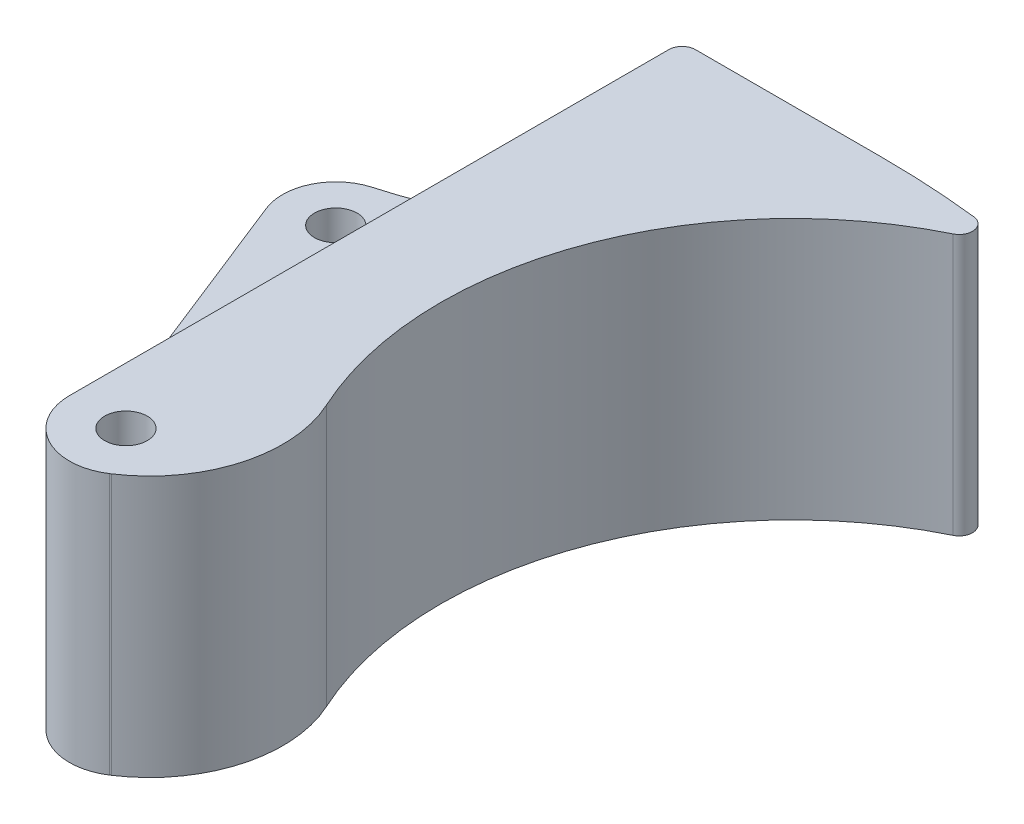
ISO-10303-21;
HEADER;
FILE_DESCRIPTION(('STEP AP214'),'2;1');
FILE_NAME('part.step','',(''),(''),'','','');
FILE_SCHEMA(('AUTOMOTIVE_DESIGN { 1 0 10303 214 1 1 1 1 }'));
ENDSEC;
DATA;
#1=APPLICATION_CONTEXT('core data for automotive mechanical design processes');
#2=APPLICATION_PROTOCOL_DEFINITION('international standard','automotive_design',2000,#1);
#3=PRODUCT_CONTEXT('',#1,'mechanical');
#4=PRODUCT('Part','Part','',(#3));
#5=PRODUCT_RELATED_PRODUCT_CATEGORY('part','',(#4));
#6=PRODUCT_DEFINITION_FORMATION('','',#4);
#7=PRODUCT_DEFINITION_CONTEXT('part definition',#1,'design');
#8=PRODUCT_DEFINITION('design','',#6,#7);
#9=PRODUCT_DEFINITION_SHAPE('','',#8);
#10=(LENGTH_UNIT() NAMED_UNIT(*) SI_UNIT(.MILLI.,.METRE.));
#11=(NAMED_UNIT(*) PLANE_ANGLE_UNIT() SI_UNIT($,.RADIAN.));
#12=(NAMED_UNIT(*) SI_UNIT($,.STERADIAN.) SOLID_ANGLE_UNIT());
#13=UNCERTAINTY_MEASURE_WITH_UNIT(LENGTH_MEASURE(1.E-05),#10,'distance_accuracy_value','');
#14=(GEOMETRIC_REPRESENTATION_CONTEXT(3) GLOBAL_UNCERTAINTY_ASSIGNED_CONTEXT((#13)) GLOBAL_UNIT_ASSIGNED_CONTEXT((#10,
#11,#12)) REPRESENTATION_CONTEXT('',''));
#15=CARTESIAN_POINT('',(0.,0.,0.));
#16=DIRECTION('',(0.,0.,1.));
#17=DIRECTION('',(1.,0.,0.));
#18=AXIS2_PLACEMENT_3D('',#15,#16,#17);
#19=CARTESIAN_POINT('',(0.,12.446,0.));
#20=DIRECTION('',(0.,1.,0.));
#21=DIRECTION('',(0.,0.,1.));
#22=AXIS2_PLACEMENT_3D('',#19,#20,#21);
#23=PLANE('',#22);
#24=DIRECTION('',(-1.,0.,0.));
#25=VECTOR('',#24,1.);
#26=CARTESIAN_POINT('',(-5.39750000000001,12.446,-58.42));
#27=LINE('',#26,#25);
#28=CARTESIAN_POINT('',(13.6525,12.446,-58.42));
#29=VERTEX_POINT('',#28);
#30=CARTESIAN_POINT('',(-4.12750000000001,12.446,-58.42));
#31=VERTEX_POINT('',#30);
#32=EDGE_CURVE('E224',#29,#31,#27,.T.);
#33=ORIENTED_EDGE('',*,*,#32,.T.);
#34=CARTESIAN_POINT('',(-4.12750000000001,12.446,-57.15));
#35=DIRECTION('',(0.,1.,0.));
#36=DIRECTION('',(0.,0.,1.));
#37=AXIS2_PLACEMENT_3D('',#34,#35,#36);
#38=CIRCLE('',#37,1.27);
#39=CARTESIAN_POINT('',(-5.39750000000001,12.446,-57.15));
#40=VERTEX_POINT('',#39);
#41=EDGE_CURVE('E300',#31,#40,#38,.T.);
#42=ORIENTED_EDGE('',*,*,#41,.T.);
#43=DIRECTION('',(0.,0.,1.));
#44=VECTOR('',#43,1.);
#45=CARTESIAN_POINT('',(-5.39750000000001,12.446,-58.42));
#46=LINE('',#45,#44);
#47=CARTESIAN_POINT('',(-5.3975,12.446,0.));
#48=VERTEX_POINT('',#47);
#49=EDGE_CURVE('E207',#40,#48,#46,.T.);
#50=ORIENTED_EDGE('',*,*,#49,.T.);
#51=CARTESIAN_POINT('',(0.,12.446,0.));
#52=DIRECTION('',(0.,1.,0.));
#53=DIRECTION('',(0.,0.,1.));
#54=AXIS2_PLACEMENT_3D('',#51,#52,#53);
#55=CIRCLE('',#54,5.3975);
#56=CARTESIAN_POINT('',(2.96093479689993,12.446,4.51285623286485));
#57=VERTEX_POINT('',#56);
#58=EDGE_CURVE('E210',#48,#57,#55,.T.);
#59=ORIENTED_EDGE('',*,*,#58,.T.);
#60=DIRECTION('',(0.836101201086587,0.,-0.548575228698459));
#61=VECTOR('',#60,1.);
#62=CARTESIAN_POINT('',(2.96093479689993,12.446,4.51285623286485));
#63=LINE('',#62,#61);
#64=CARTESIAN_POINT('',(3.06233772324981,12.446,4.44632465338525));
#65=VERTEX_POINT('',#64);
#66=EDGE_CURVE('E214',#57,#65,#63,.T.);
#67=ORIENTED_EDGE('',*,*,#66,.T.);
#68=CARTESIAN_POINT('',(-3.90456768122061,12.446,-6.1721606004144));
#69=DIRECTION('',(0.,1.,0.));
#70=DIRECTION('',(0.,0.,1.));
#71=AXIS2_PLACEMENT_3D('',#68,#69,#70);
#72=CIRCLE('',#71,12.7);
#73=CARTESIAN_POINT('',(7.64307979127989,12.446,-11.4581645590634));
#74=VERTEX_POINT('',#73);
#75=EDGE_CURVE('E269',#65,#74,#72,.T.);
#76=ORIENTED_EDGE('',*,*,#75,.T.);
#77=CARTESIAN_POINT('',(38.1,12.446,-25.4));
#78=DIRECTION('',(0.,-1.,0.));
#79=DIRECTION('',(0.,0.,1.));
#80=AXIS2_PLACEMENT_3D('',#77,#78,#79);
#81=CIRCLE('',#80,33.49625);
#82=CARTESIAN_POINT('',(23.3731145766902,12.446,-55.485172590351));
#83=VERTEX_POINT('',#82);
#84=EDGE_CURVE('E218',#74,#83,#81,.T.);
#85=ORIENTED_EDGE('',*,*,#84,.T.);
#86=CARTESIAN_POINT('',(22.8147492525837,12.446,-56.62584264117));
#87=DIRECTION('',(0.,1.,0.));
#88=DIRECTION('',(0.,0.,1.));
#89=AXIS2_PLACEMENT_3D('',#86,#87,#88);
#90=CIRCLE('',#89,1.27);
#91=CARTESIAN_POINT('',(22.9595844996685,12.446,-57.8875568525514));
#92=VERTEX_POINT('',#91);
#93=EDGE_CURVE('E59',#83,#92,#90,.T.);
#94=ORIENTED_EDGE('',*,*,#93,.T.);
#95=CARTESIAN_POINT('',(13.6525,12.446,23.1899502882853));
#96=DIRECTION('',(0.,1.,0.));
#97=DIRECTION('',(0.,0.,1.));
#98=AXIS2_PLACEMENT_3D('',#95,#96,#97);
#99=CIRCLE('',#98,81.6099502882853);
#100=EDGE_CURVE('E221',#92,#29,#99,.T.);
#101=ORIENTED_EDGE('',*,*,#100,.T.);
#102=EDGE_LOOP('',(#33,#42,#50,#59,#67,#76,#85,#94,#101));
#103=FACE_BOUND('',#102,.T.);
#104=CARTESIAN_POINT('',(0.,12.446,0.));
#105=DIRECTION('',(0.,1.,0.));
#106=DIRECTION('',(0.,0.,1.));
#107=AXIS2_PLACEMENT_3D('',#104,#105,#106);
#108=CIRCLE('',#107,2.032);
#109=CARTESIAN_POINT('',(0.,12.446,2.032));
#110=VERTEX_POINT('',#109);
#111=EDGE_CURVE('E199',#110,#110,#108,.T.);
#112=ORIENTED_EDGE('',*,*,#111,.F.);
#113=EDGE_LOOP('',(#112));
#114=FACE_BOUND('',#113,.T.);
#115=ADVANCED_FACE('F43',(#103,#114),#23,.T.);
#116=CARTESIAN_POINT('',(0.,-12.446,0.));
#117=DIRECTION('',(0.,1.,0.));
#118=DIRECTION('',(0.,0.,1.));
#119=AXIS2_PLACEMENT_3D('',#116,#117,#118);
#120=PLANE('',#119);
#121=DIRECTION('',(0.,0.,1.));
#122=VECTOR('',#121,1.);
#123=CARTESIAN_POINT('',(-5.39750000000001,-12.446,-58.42));
#124=LINE('',#123,#122);
#125=CARTESIAN_POINT('',(-5.39750000000001,-12.446,-57.15));
#126=VERTEX_POINT('',#125);
#127=CARTESIAN_POINT('',(-5.3975,-12.446,0.));
#128=VERTEX_POINT('',#127);
#129=EDGE_CURVE('E203',#126,#128,#124,.T.);
#130=ORIENTED_EDGE('',*,*,#129,.F.);
#131=CARTESIAN_POINT('',(-4.12750000000001,-12.446,-57.15));
#132=DIRECTION('',(0.,1.,0.));
#133=DIRECTION('',(0.,0.,1.));
#134=AXIS2_PLACEMENT_3D('',#131,#132,#133);
#135=CIRCLE('',#134,1.27);
#136=CARTESIAN_POINT('',(-4.12750000000001,-12.446,-58.42));
#137=VERTEX_POINT('',#136);
#138=EDGE_CURVE('E292',#126,#137,#135,.F.);
#139=ORIENTED_EDGE('',*,*,#138,.T.);
#140=DIRECTION('',(-1.,0.,0.));
#141=VECTOR('',#140,1.);
#142=CARTESIAN_POINT('',(-5.39750000000001,-12.446,-58.42));
#143=LINE('',#142,#141);
#144=CARTESIAN_POINT('',(13.6525,-12.446,-58.42));
#145=VERTEX_POINT('',#144);
#146=EDGE_CURVE('E211',#145,#137,#143,.T.);
#147=ORIENTED_EDGE('',*,*,#146,.F.);
#148=CARTESIAN_POINT('',(13.6525,-12.446,23.1899502882853));
#149=DIRECTION('',(0.,1.,0.));
#150=DIRECTION('',(0.,0.,1.));
#151=AXIS2_PLACEMENT_3D('',#148,#149,#150);
#152=CIRCLE('',#151,81.6099502882853);
#153=CARTESIAN_POINT('',(22.9595844996685,-12.446,-57.8875568525514));
#154=VERTEX_POINT('',#153);
#155=EDGE_CURVE('E241',#154,#145,#152,.T.);
#156=ORIENTED_EDGE('',*,*,#155,.F.);
#157=CARTESIAN_POINT('',(22.8147492525837,-12.446,-56.62584264117));
#158=DIRECTION('',(0.,1.,0.));
#159=DIRECTION('',(0.,0.,1.));
#160=AXIS2_PLACEMENT_3D('',#157,#158,#159);
#161=CIRCLE('',#160,1.27);
#162=CARTESIAN_POINT('',(23.3731145766902,-12.446,-55.485172590351));
#163=VERTEX_POINT('',#162);
#164=EDGE_CURVE('E289',#154,#163,#161,.F.);
#165=ORIENTED_EDGE('',*,*,#164,.T.);
#166=CARTESIAN_POINT('',(38.1,-12.446,-25.4));
#167=DIRECTION('',(0.,-1.,0.));
#168=DIRECTION('',(0.,0.,1.));
#169=AXIS2_PLACEMENT_3D('',#166,#167,#168);
#170=CIRCLE('',#169,33.49625);
#171=CARTESIAN_POINT('',(7.64307979127989,-12.446,-11.4581645590634));
#172=VERTEX_POINT('',#171);
#173=EDGE_CURVE('E238',#172,#163,#170,.T.);
#174=ORIENTED_EDGE('',*,*,#173,.F.);
#175=CARTESIAN_POINT('',(-3.90456768122061,-12.446,-6.1721606004144));
#176=DIRECTION('',(0.,1.,0.));
#177=DIRECTION('',(0.,0.,1.));
#178=AXIS2_PLACEMENT_3D('',#175,#176,#177);
#179=CIRCLE('',#178,12.7);
#180=CARTESIAN_POINT('',(3.06233772324981,-12.446,4.44632465338525));
#181=VERTEX_POINT('',#180);
#182=EDGE_CURVE('E263',#172,#181,#179,.F.);
#183=ORIENTED_EDGE('',*,*,#182,.T.);
#184=DIRECTION('',(0.836101201086587,0.,-0.548575228698459));
#185=VECTOR('',#184,1.);
#186=CARTESIAN_POINT('',(2.96093479689993,-12.446,4.51285623286485));
#187=LINE('',#186,#185);
#188=CARTESIAN_POINT('',(2.96093479689993,-12.446,4.51285623286485));
#189=VERTEX_POINT('',#188);
#190=EDGE_CURVE('E234',#189,#181,#187,.T.);
#191=ORIENTED_EDGE('',*,*,#190,.F.);
#192=CARTESIAN_POINT('',(0.,-12.446,0.));
#193=DIRECTION('',(0.,1.,0.));
#194=DIRECTION('',(0.,0.,1.));
#195=AXIS2_PLACEMENT_3D('',#192,#193,#194);
#196=CIRCLE('',#195,5.3975);
#197=EDGE_CURVE('E231',#128,#189,#196,.T.);
#198=ORIENTED_EDGE('',*,*,#197,.F.);
#199=EDGE_LOOP('',(#130,#139,#147,#156,#165,#174,#183,#191,#198));
#200=FACE_BOUND('',#199,.T.);
#201=CARTESIAN_POINT('',(0.,-12.446,0.));
#202=DIRECTION('',(0.,1.,0.));
#203=DIRECTION('',(0.,0.,1.));
#204=AXIS2_PLACEMENT_3D('',#201,#202,#203);
#205=CIRCLE('',#204,2.032);
#206=CARTESIAN_POINT('',(0.,-12.446,2.032));
#207=VERTEX_POINT('',#206);
#208=EDGE_CURVE('E167',#207,#207,#205,.T.);
#209=ORIENTED_EDGE('',*,*,#208,.T.);
#210=EDGE_LOOP('',(#209));
#211=FACE_BOUND('',#210,.T.);
#212=ADVANCED_FACE('F313',(#200,#211),#120,.F.);
#213=CARTESIAN_POINT('',(-5.39750000000001,12.446,-58.42));
#214=DIRECTION('',(1.,0.,0.));
#215=DIRECTION('',(0.,0.,-1.));
#216=AXIS2_PLACEMENT_3D('',#213,#214,#215);
#217=PLANE('',#216);
#218=ORIENTED_EDGE('',*,*,#49,.F.);
#219=DIRECTION('',(0.,-1.,0.));
#220=VECTOR('',#219,1.);
#221=CARTESIAN_POINT('',(-5.39750000000001,12.446,-57.15));
#222=LINE('',#221,#220);
#223=EDGE_CURVE('E285',#40,#126,#222,.T.);
#224=ORIENTED_EDGE('',*,*,#223,.T.);
#225=ORIENTED_EDGE('',*,*,#129,.T.);
#226=DIRECTION('',(0.,-1.,0.));
#227=VECTOR('',#226,1.);
#228=CARTESIAN_POINT('',(-5.3975,12.446,0.));
#229=LINE('',#228,#227);
#230=CARTESIAN_POINT('',(-5.3975,-6.19125,0.));
#231=VERTEX_POINT('',#230);
#232=EDGE_CURVE('E254',#231,#128,#229,.T.);
#233=ORIENTED_EDGE('',*,*,#232,.F.);
#234=DIRECTION('',(0.,0.,-1.));
#235=VECTOR('',#234,1.);
#236=CARTESIAN_POINT('',(-5.39750000000001,-6.19125,-40.64));
#237=LINE('',#236,#235);
#238=CARTESIAN_POINT('',(-5.39750000000001,-6.19125,-48.1752390496232));
#239=VERTEX_POINT('',#238);
#240=EDGE_CURVE('E181',#231,#239,#237,.T.);
#241=ORIENTED_EDGE('',*,*,#240,.T.);
#242=DIRECTION('',(0.,-1.,0.));
#243=VECTOR('',#242,1.);
#244=CARTESIAN_POINT('',(-5.39750000000001,6.19125,-48.1752390496232));
#245=LINE('',#244,#243);
#246=CARTESIAN_POINT('',(-5.39750000000001,6.19125,-48.1752390496232));
#247=VERTEX_POINT('',#246);
#248=EDGE_CURVE('E275',#239,#247,#245,.F.);
#249=ORIENTED_EDGE('',*,*,#248,.T.);
#250=DIRECTION('',(0.,0.,-1.));
#251=VECTOR('',#250,1.);
#252=CARTESIAN_POINT('',(-5.39750000000001,6.19125,-40.64));
#253=LINE('',#252,#251);
#254=CARTESIAN_POINT('',(-5.3975,6.19125,0.));
#255=VERTEX_POINT('',#254);
#256=EDGE_CURVE('E157',#255,#247,#253,.T.);
#257=ORIENTED_EDGE('',*,*,#256,.F.);
#258=EDGE_CURVE('E255',#48,#255,#229,.T.);
#259=ORIENTED_EDGE('',*,*,#258,.F.);
#260=EDGE_LOOP('',(#218,#224,#225,#233,#241,#249,#257,#259));
#261=FACE_BOUND('',#260,.T.);
#262=ADVANCED_FACE('F329',(#261),#217,.F.);
#263=CARTESIAN_POINT('',(0.,12.446,0.));
#264=DIRECTION('',(0.,-1.,0.));
#265=DIRECTION('',(0.,0.,-1.));
#266=AXIS2_PLACEMENT_3D('',#263,#264,#265);
#267=CYLINDRICAL_SURFACE('',#266,5.3975);
#268=ORIENTED_EDGE('',*,*,#197,.T.);
#269=DIRECTION('',(0.,-1.,0.));
#270=VECTOR('',#269,1.);
#271=CARTESIAN_POINT('',(2.96093479689993,12.446,4.51285623286485));
#272=LINE('',#271,#270);
#273=EDGE_CURVE('E250',#57,#189,#272,.T.);
#274=ORIENTED_EDGE('',*,*,#273,.F.);
#275=ORIENTED_EDGE('',*,*,#58,.F.);
#276=ORIENTED_EDGE('',*,*,#258,.T.);
#277=DIRECTION('',(0.,-1.,0.));
#278=VECTOR('',#277,1.);
#279=CARTESIAN_POINT('',(-5.3975,6.19125,0.));
#280=LINE('',#279,#278);
#281=EDGE_CURVE('E177',#255,#231,#280,.T.);
#282=ORIENTED_EDGE('',*,*,#281,.T.);
#283=ORIENTED_EDGE('',*,*,#232,.T.);
#284=EDGE_LOOP('',(#268,#274,#275,#276,#282,#283));
#285=FACE_BOUND('',#284,.T.);
#286=ADVANCED_FACE('F332',(#285),#267,.T.);
#287=CARTESIAN_POINT('',(2.96093479689993,12.446,4.51285623286485));
#288=DIRECTION('',(-0.548575228698459,0.,-0.836101201086587));
#289=DIRECTION('',(-0.836101201086587,0.,0.548575228698459));
#290=AXIS2_PLACEMENT_3D('',#287,#288,#289);
#291=PLANE('',#290);
#292=ORIENTED_EDGE('',*,*,#190,.T.);
#293=DIRECTION('',(0.,-1.,0.));
#294=VECTOR('',#293,1.);
#295=CARTESIAN_POINT('',(3.06233772324981,12.446,4.44632465338525));
#296=LINE('',#295,#294);
#297=EDGE_CURVE('E266',#181,#65,#296,.F.);
#298=ORIENTED_EDGE('',*,*,#297,.T.);
#299=ORIENTED_EDGE('',*,*,#66,.F.);
#300=ORIENTED_EDGE('',*,*,#273,.T.);
#301=EDGE_LOOP('',(#292,#298,#299,#300));
#302=FACE_BOUND('',#301,.T.);
#303=ADVANCED_FACE('F346',(#302),#291,.F.);
#304=CARTESIAN_POINT('',(38.1,12.446,-25.4));
#305=DIRECTION('',(0.,-1.,0.));
#306=DIRECTION('',(0.,0.,-1.));
#307=AXIS2_PLACEMENT_3D('',#304,#305,#306);
#308=CYLINDRICAL_SURFACE('',#307,33.49625);
#309=ORIENTED_EDGE('',*,*,#173,.T.);
#310=DIRECTION('',(0.,-1.,0.));
#311=VECTOR('',#310,1.);
#312=CARTESIAN_POINT('',(23.3731145766902,12.446,-55.485172590351));
#313=LINE('',#312,#311);
#314=EDGE_CURVE('E11',#163,#83,#313,.F.);
#315=ORIENTED_EDGE('',*,*,#314,.T.);
#316=ORIENTED_EDGE('',*,*,#84,.F.);
#317=DIRECTION('',(0.,-1.,0.));
#318=VECTOR('',#317,1.);
#319=CARTESIAN_POINT('',(7.64307979127989,12.446,-11.4581645590634));
#320=LINE('',#319,#318);
#321=EDGE_CURVE('E259',#74,#172,#320,.T.);
#322=ORIENTED_EDGE('',*,*,#321,.T.);
#323=EDGE_LOOP('',(#309,#315,#316,#322));
#324=FACE_BOUND('',#323,.T.);
#325=ADVANCED_FACE('F343',(#324),#308,.F.);
#326=CARTESIAN_POINT('',(13.6525,12.446,23.1899502882853));
#327=DIRECTION('',(0.,-1.,0.));
#328=DIRECTION('',(0.,0.,-1.));
#329=AXIS2_PLACEMENT_3D('',#326,#327,#328);
#330=CYLINDRICAL_SURFACE('',#329,81.6099502882853);
#331=ORIENTED_EDGE('',*,*,#100,.F.);
#332=DIRECTION('',(0.,-1.,0.));
#333=VECTOR('',#332,1.);
#334=CARTESIAN_POINT('',(22.9595844996685,12.446,-57.8875568525514));
#335=LINE('',#334,#333);
#336=EDGE_CURVE('E52',#92,#154,#335,.T.);
#337=ORIENTED_EDGE('',*,*,#336,.T.);
#338=ORIENTED_EDGE('',*,*,#155,.T.);
#339=DIRECTION('',(0.,-1.,0.));
#340=VECTOR('',#339,1.);
#341=CARTESIAN_POINT('',(13.6525,12.446,-58.42));
#342=LINE('',#341,#340);
#343=EDGE_CURVE('E228',#29,#145,#342,.T.);
#344=ORIENTED_EDGE('',*,*,#343,.F.);
#345=EDGE_LOOP('',(#331,#337,#338,#344));
#346=FACE_BOUND('',#345,.T.);
#347=ADVANCED_FACE('F307',(#346),#330,.T.);
#348=CARTESIAN_POINT('',(-5.39750000000001,12.446,-58.42));
#349=DIRECTION('',(0.,0.,1.));
#350=DIRECTION('',(1.,0.,0.));
#351=AXIS2_PLACEMENT_3D('',#348,#349,#350);
#352=PLANE('',#351);
#353=ORIENTED_EDGE('',*,*,#146,.T.);
#354=DIRECTION('',(0.,-1.,0.));
#355=VECTOR('',#354,1.);
#356=CARTESIAN_POINT('',(-4.12750000000001,12.446,-58.42));
#357=LINE('',#356,#355);
#358=EDGE_CURVE('E295',#137,#31,#357,.F.);
#359=ORIENTED_EDGE('',*,*,#358,.T.);
#360=ORIENTED_EDGE('',*,*,#32,.F.);
#361=ORIENTED_EDGE('',*,*,#343,.T.);
#362=EDGE_LOOP('',(#353,#359,#360,#361));
#363=FACE_BOUND('',#362,.T.);
#364=ADVANCED_FACE('F318',(#363),#352,.F.);
#365=CARTESIAN_POINT('',(0.,12.446,0.));
#366=DIRECTION('',(0.,-1.,0.));
#367=DIRECTION('',(0.,0.,-1.));
#368=AXIS2_PLACEMENT_3D('',#365,#366,#367);
#369=CYLINDRICAL_SURFACE('',#368,2.032);
#370=ORIENTED_EDGE('',*,*,#111,.T.);
#371=EDGE_LOOP('',(#370));
#372=FACE_BOUND('',#371,.T.);
#373=ORIENTED_EDGE('',*,*,#208,.F.);
#374=EDGE_LOOP('',(#373));
#375=FACE_BOUND('',#374,.T.);
#376=ADVANCED_FACE('F362',(#372,#375),#369,.F.);
#377=CARTESIAN_POINT('',(-3.90456768122061,12.446,-6.1721606004144));
#378=DIRECTION('',(0.,-1.,0.));
#379=DIRECTION('',(0.,0.,-1.));
#380=AXIS2_PLACEMENT_3D('',#377,#378,#379);
#381=CYLINDRICAL_SURFACE('',#380,12.7);
#382=ORIENTED_EDGE('',*,*,#75,.F.);
#383=ORIENTED_EDGE('',*,*,#297,.F.);
#384=ORIENTED_EDGE('',*,*,#182,.F.);
#385=ORIENTED_EDGE('',*,*,#321,.F.);
#386=EDGE_LOOP('',(#382,#383,#384,#385));
#387=FACE_BOUND('',#386,.T.);
#388=ADVANCED_FACE('F342',(#387),#381,.T.);
#389=CARTESIAN_POINT('',(-13.0175,6.19125,-33.02));
#390=DIRECTION('',(0.,1.,0.));
#391=DIRECTION('',(0.,0.,1.));
#392=AXIS2_PLACEMENT_3D('',#389,#390,#391);
#393=PLANE('',#392);
#394=ORIENTED_EDGE('',*,*,#256,.T.);
#395=CARTESIAN_POINT('',(-15.5575,6.19125,-48.1752390496232));
#396=DIRECTION('',(0.,1.,0.));
#397=DIRECTION('',(0.,0.,1.));
#398=AXIS2_PLACEMENT_3D('',#395,#396,#397);
#399=CIRCLE('',#398,10.16);
#400=CARTESIAN_POINT('',(-12.6082934917295,6.19125,-38.4526992080194));
#401=VERTEX_POINT('',#400);
#402=EDGE_CURVE('E152',#247,#401,#399,.F.);
#403=ORIENTED_EDGE('',*,*,#402,.T.);
#404=DIRECTION('',(-0.956942897795657,0.,0.29027623112899));
#405=VECTOR('',#404,1.);
#406=CARTESIAN_POINT('',(-5.39750000000001,6.19125,-40.64));
#407=LINE('',#406,#405);
#408=CARTESIAN_POINT('',(-14.4921032541353,6.19125,-37.8812699208019));
#409=VERTEX_POINT('',#408);
#410=EDGE_CURVE('E144',#401,#409,#407,.T.);
#411=ORIENTED_EDGE('',*,*,#410,.T.);
#412=CARTESIAN_POINT('',(-13.0175,6.19125,-33.02));
#413=DIRECTION('',(0.,1.,0.));
#414=DIRECTION('',(0.,0.,1.));
#415=AXIS2_PLACEMENT_3D('',#412,#413,#414);
#416=CIRCLE('',#415,5.08);
#417=CARTESIAN_POINT('',(-17.7402383678896,6.19125,-31.1485988381793));
#418=VERTEX_POINT('',#417);
#419=EDGE_CURVE('E149',#409,#418,#416,.T.);
#420=ORIENTED_EDGE('',*,*,#419,.T.);
#421=DIRECTION('',(0.36838605547651,0.,0.929672907064876));
#422=VECTOR('',#421,1.);
#423=CARTESIAN_POINT('',(-5.3975,6.19125,0.));
#424=LINE('',#423,#422);
#425=EDGE_CURVE('E174',#418,#255,#424,.T.);
#426=ORIENTED_EDGE('',*,*,#425,.T.);
#427=EDGE_LOOP('',(#394,#403,#411,#420,#426));
#428=FACE_BOUND('',#427,.T.);
#429=CARTESIAN_POINT('',(-13.0175,6.19125,-33.02));
#430=DIRECTION('',(0.,1.,0.));
#431=DIRECTION('',(0.,0.,1.));
#432=AXIS2_PLACEMENT_3D('',#429,#430,#431);
#433=CIRCLE('',#432,2.032);
#434=CARTESIAN_POINT('',(-13.0175,6.19125,-30.988));
#435=VERTEX_POINT('',#434);
#436=EDGE_CURVE('E184',#435,#435,#433,.T.);
#437=ORIENTED_EDGE('',*,*,#436,.F.);
#438=EDGE_LOOP('',(#437));
#439=FACE_BOUND('',#438,.T.);
#440=ADVANCED_FACE('F146',(#428,#439),#393,.T.);
#441=CARTESIAN_POINT('',(-13.0175,-6.19125,-33.02));
#442=DIRECTION('',(0.,1.,0.));
#443=DIRECTION('',(0.,0.,1.));
#444=AXIS2_PLACEMENT_3D('',#441,#442,#443);
#445=PLANE('',#444);
#446=ORIENTED_EDGE('',*,*,#240,.F.);
#447=DIRECTION('',(0.36838605547651,0.,0.929672907064876));
#448=VECTOR('',#447,1.);
#449=CARTESIAN_POINT('',(-5.3975,-6.19125,0.));
#450=LINE('',#449,#448);
#451=CARTESIAN_POINT('',(-17.7402383678896,-6.19125,-31.1485988381793));
#452=VERTEX_POINT('',#451);
#453=EDGE_CURVE('E190',#452,#231,#450,.T.);
#454=ORIENTED_EDGE('',*,*,#453,.F.);
#455=CARTESIAN_POINT('',(-13.0175,-6.19125,-33.02));
#456=DIRECTION('',(0.,1.,0.));
#457=DIRECTION('',(0.,0.,1.));
#458=AXIS2_PLACEMENT_3D('',#455,#456,#457);
#459=CIRCLE('',#458,5.08);
#460=CARTESIAN_POINT('',(-14.4921032541353,-6.19125,-37.8812699208019));
#461=VERTEX_POINT('',#460);
#462=EDGE_CURVE('E187',#461,#452,#459,.T.);
#463=ORIENTED_EDGE('',*,*,#462,.F.);
#464=DIRECTION('',(-0.956942897795657,0.,0.29027623112899));
#465=VECTOR('',#464,1.);
#466=CARTESIAN_POINT('',(-5.39750000000001,-6.19125,-40.64));
#467=LINE('',#466,#465);
#468=CARTESIAN_POINT('',(-12.6082934917295,-6.19125,-38.4526992080194));
#469=VERTEX_POINT('',#468);
#470=EDGE_CURVE('E163',#469,#461,#467,.T.);
#471=ORIENTED_EDGE('',*,*,#470,.F.);
#472=CARTESIAN_POINT('',(-15.5575,-6.19125,-48.1752390496232));
#473=DIRECTION('',(0.,1.,0.));
#474=DIRECTION('',(0.,0.,1.));
#475=AXIS2_PLACEMENT_3D('',#472,#473,#474);
#476=CIRCLE('',#475,10.16);
#477=EDGE_CURVE('E279',#469,#239,#476,.T.);
#478=ORIENTED_EDGE('',*,*,#477,.T.);
#479=EDGE_LOOP('',(#446,#454,#463,#471,#478));
#480=FACE_BOUND('',#479,.T.);
#481=CARTESIAN_POINT('',(-13.0175,-6.19125,-33.02));
#482=DIRECTION('',(0.,1.,0.));
#483=DIRECTION('',(0.,0.,1.));
#484=AXIS2_PLACEMENT_3D('',#481,#482,#483);
#485=CIRCLE('',#484,2.032);
#486=CARTESIAN_POINT('',(-13.0175,-6.19125,-30.988));
#487=VERTEX_POINT('',#486);
#488=EDGE_CURVE('E555',#487,#487,#485,.T.);
#489=ORIENTED_EDGE('',*,*,#488,.T.);
#490=EDGE_LOOP('',(#489));
#491=FACE_BOUND('',#490,.T.);
#492=ADVANCED_FACE('F396',(#480,#491),#445,.F.);
#493=CARTESIAN_POINT('',(-5.39750000000001,6.19125,-40.64));
#494=DIRECTION('',(0.29027623112899,0.,0.956942897795657));
#495=DIRECTION('',(0.956942897795657,0.,-0.290276231128991));
#496=AXIS2_PLACEMENT_3D('',#493,#494,#495);
#497=PLANE('',#496);
#498=ORIENTED_EDGE('',*,*,#410,.F.);
#499=DIRECTION('',(0.,-1.,0.));
#500=VECTOR('',#499,1.);
#501=CARTESIAN_POINT('',(-12.6082934917295,-6.19125,-38.4526992080194));
#502=LINE('',#501,#500);
#503=EDGE_CURVE('E272',#401,#469,#502,.T.);
#504=ORIENTED_EDGE('',*,*,#503,.T.);
#505=ORIENTED_EDGE('',*,*,#470,.T.);
#506=DIRECTION('',(0.,-1.,0.));
#507=VECTOR('',#506,1.);
#508=CARTESIAN_POINT('',(-14.4921032541353,6.19125,-37.8812699208019));
#509=LINE('',#508,#507);
#510=EDGE_CURVE('E160',#409,#461,#509,.T.);
#511=ORIENTED_EDGE('',*,*,#510,.F.);
#512=EDGE_LOOP('',(#498,#504,#505,#511));
#513=FACE_BOUND('',#512,.T.);
#514=ADVANCED_FACE('F161',(#513),#497,.F.);
#515=CARTESIAN_POINT('',(-13.0175,6.19125,-33.02));
#516=DIRECTION('',(0.,-1.,0.));
#517=DIRECTION('',(0.,0.,-1.));
#518=AXIS2_PLACEMENT_3D('',#515,#516,#517);
#519=CYLINDRICAL_SURFACE('',#518,5.08);
#520=ORIENTED_EDGE('',*,*,#462,.T.);
#521=DIRECTION('',(0.,-1.,0.));
#522=VECTOR('',#521,1.);
#523=CARTESIAN_POINT('',(-17.7402383678896,6.19125,-31.1485988381793));
#524=LINE('',#523,#522);
#525=EDGE_CURVE('E168',#418,#452,#524,.T.);
#526=ORIENTED_EDGE('',*,*,#525,.F.);
#527=ORIENTED_EDGE('',*,*,#419,.F.);
#528=ORIENTED_EDGE('',*,*,#510,.T.);
#529=EDGE_LOOP('',(#520,#526,#527,#528));
#530=FACE_BOUND('',#529,.T.);
#531=ADVANCED_FACE('F170',(#530),#519,.T.);
#532=CARTESIAN_POINT('',(-5.3975,6.19125,0.));
#533=DIRECTION('',(0.929672907064876,0.,-0.36838605547651));
#534=DIRECTION('',(-0.36838605547651,0.,-0.929672907064876));
#535=AXIS2_PLACEMENT_3D('',#532,#533,#534);
#536=PLANE('',#535);
#537=ORIENTED_EDGE('',*,*,#453,.T.);
#538=ORIENTED_EDGE('',*,*,#281,.F.);
#539=ORIENTED_EDGE('',*,*,#425,.F.);
#540=ORIENTED_EDGE('',*,*,#525,.T.);
#541=EDGE_LOOP('',(#537,#538,#539,#540));
#542=FACE_BOUND('',#541,.T.);
#543=ADVANCED_FACE('F417',(#542),#536,.F.);
#544=CARTESIAN_POINT('',(-13.0175,6.19125,-33.02));
#545=DIRECTION('',(0.,-1.,0.));
#546=DIRECTION('',(0.,0.,-1.));
#547=AXIS2_PLACEMENT_3D('',#544,#545,#546);
#548=CYLINDRICAL_SURFACE('',#547,2.032);
#549=ORIENTED_EDGE('',*,*,#436,.T.);
#550=EDGE_LOOP('',(#549));
#551=FACE_BOUND('',#550,.T.);
#552=ORIENTED_EDGE('',*,*,#488,.F.);
#553=EDGE_LOOP('',(#552));
#554=FACE_BOUND('',#553,.T.);
#555=ADVANCED_FACE('F424',(#551,#554),#548,.F.);
#556=CARTESIAN_POINT('',(-15.5575,6.19125,-48.1752390496232));
#557=DIRECTION('',(0.,1.,0.));
#558=DIRECTION('',(0.,0.,1.));
#559=AXIS2_PLACEMENT_3D('',#556,#557,#558);
#560=CYLINDRICAL_SURFACE('',#559,10.16);
#561=ORIENTED_EDGE('',*,*,#402,.F.);
#562=ORIENTED_EDGE('',*,*,#248,.F.);
#563=ORIENTED_EDGE('',*,*,#477,.F.);
#564=ORIENTED_EDGE('',*,*,#503,.F.);
#565=EDGE_LOOP('',(#561,#562,#563,#564));
#566=FACE_BOUND('',#565,.T.);
#567=ADVANCED_FACE('F431',(#566),#560,.F.);
#568=CARTESIAN_POINT('',(-4.12750000000001,12.446,-57.15));
#569=DIRECTION('',(0.,-1.,0.));
#570=DIRECTION('',(0.,0.,-1.));
#571=AXIS2_PLACEMENT_3D('',#568,#569,#570);
#572=CYLINDRICAL_SURFACE('',#571,1.27);
#573=ORIENTED_EDGE('',*,*,#41,.F.);
#574=ORIENTED_EDGE('',*,*,#358,.F.);
#575=ORIENTED_EDGE('',*,*,#138,.F.);
#576=ORIENTED_EDGE('',*,*,#223,.F.);
#577=EDGE_LOOP('',(#573,#574,#575,#576));
#578=FACE_BOUND('',#577,.T.);
#579=ADVANCED_FACE('F322',(#578),#572,.T.);
#580=CARTESIAN_POINT('',(22.8147492525837,12.446,-56.62584264117));
#581=DIRECTION('',(0.,1.,0.));
#582=DIRECTION('',(0.,0.,1.));
#583=AXIS2_PLACEMENT_3D('',#580,#581,#582);
#584=CYLINDRICAL_SURFACE('',#583,1.27);
#585=ORIENTED_EDGE('',*,*,#93,.F.);
#586=ORIENTED_EDGE('',*,*,#314,.F.);
#587=ORIENTED_EDGE('',*,*,#164,.F.);
#588=ORIENTED_EDGE('',*,*,#336,.F.);
#589=EDGE_LOOP('',(#585,#586,#587,#588));
#590=FACE_BOUND('',#589,.T.);
#591=ADVANCED_FACE('F45',(#590),#584,.T.);
#592=CLOSED_SHELL('',(#115,#212,#262,#286,#303,#325,#347,#364,#376,#388,#440,#492,#514,#531,
#543,#555,#567,#579,#591));
#593=MANIFOLD_SOLID_BREP('B2',#592);
#594=ADVANCED_BREP_SHAPE_REPRESENTATION('',(#18,#593),#14);
#595=SHAPE_DEFINITION_REPRESENTATION(#9,#594);
ENDSEC;
END-ISO-10303-21;
